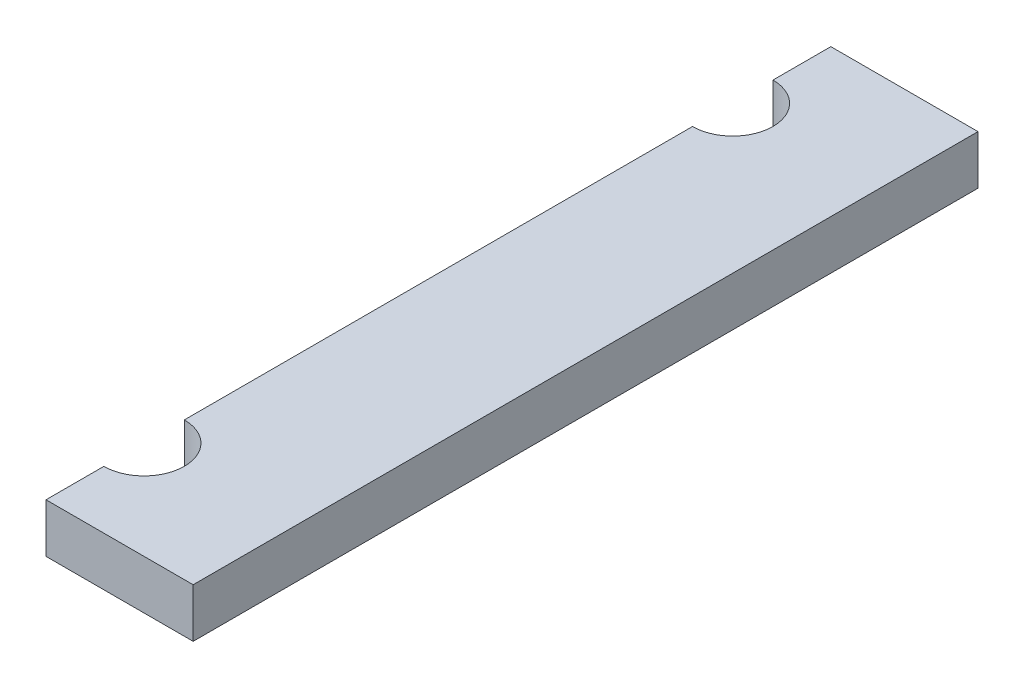
ISO-10303-21;
HEADER;
FILE_DESCRIPTION(('STEP AP214'),'2;1');
FILE_NAME('part.step','',(''),(''),'','','');
FILE_SCHEMA(('AUTOMOTIVE_DESIGN { 1 0 10303 214 1 1 1 1 }'));
ENDSEC;
DATA;
#1=APPLICATION_CONTEXT('core data for automotive mechanical design processes');
#2=APPLICATION_PROTOCOL_DEFINITION('international standard','automotive_design',2000,#1);
#3=PRODUCT_CONTEXT('',#1,'mechanical');
#4=PRODUCT('Part','Part','',(#3));
#5=PRODUCT_RELATED_PRODUCT_CATEGORY('part','',(#4));
#6=PRODUCT_DEFINITION_FORMATION('','',#4);
#7=PRODUCT_DEFINITION_CONTEXT('part definition',#1,'design');
#8=PRODUCT_DEFINITION('design','',#6,#7);
#9=PRODUCT_DEFINITION_SHAPE('','',#8);
#10=(LENGTH_UNIT() NAMED_UNIT(*) SI_UNIT(.MILLI.,.METRE.));
#11=(NAMED_UNIT(*) PLANE_ANGLE_UNIT() SI_UNIT($,.RADIAN.));
#12=(NAMED_UNIT(*) SI_UNIT($,.STERADIAN.) SOLID_ANGLE_UNIT());
#13=UNCERTAINTY_MEASURE_WITH_UNIT(LENGTH_MEASURE(1.E-05),#10,'distance_accuracy_value','');
#14=(GEOMETRIC_REPRESENTATION_CONTEXT(3) GLOBAL_UNCERTAINTY_ASSIGNED_CONTEXT((#13)) GLOBAL_UNIT_ASSIGNED_CONTEXT((#10,
#11,#12)) REPRESENTATION_CONTEXT('',''));
#15=CARTESIAN_POINT('',(0.,0.,0.));
#16=DIRECTION('',(0.,0.,1.));
#17=DIRECTION('',(1.,0.,0.));
#18=AXIS2_PLACEMENT_3D('',#15,#16,#17);
#19=CARTESIAN_POINT('',(15.,5.,0.));
#20=DIRECTION('',(-1.,0.,0.));
#21=DIRECTION('',(0.,0.,1.));
#22=AXIS2_PLACEMENT_3D('',#19,#20,#21);
#23=PLANE('',#22);
#24=DIRECTION('',(0.,0.,-1.));
#25=VECTOR('',#24,1.);
#26=CARTESIAN_POINT('',(15.,0.,0.));
#27=LINE('',#26,#25);
#28=CARTESIAN_POINT('',(15.,0.,0.));
#29=VERTEX_POINT('',#28);
#30=CARTESIAN_POINT('',(15.,0.,-80.));
#31=VERTEX_POINT('',#30);
#32=EDGE_CURVE('E197',#29,#31,#27,.T.);
#33=ORIENTED_EDGE('',*,*,#32,.T.);
#34=DIRECTION('',(0.,-1.,0.));
#35=VECTOR('',#34,1.);
#36=CARTESIAN_POINT('',(15.,5.,-80.));
#37=LINE('',#36,#35);
#38=CARTESIAN_POINT('',(15.,5.,-80.));
#39=VERTEX_POINT('',#38);
#40=EDGE_CURVE('E11',#39,#31,#37,.T.);
#41=ORIENTED_EDGE('',*,*,#40,.F.);
#42=DIRECTION('',(0.,0.,-1.));
#43=VECTOR('',#42,1.);
#44=CARTESIAN_POINT('',(15.,5.,0.));
#45=LINE('',#44,#43);
#46=CARTESIAN_POINT('',(15.,5.,0.));
#47=VERTEX_POINT('',#46);
#48=EDGE_CURVE('E100',#47,#39,#45,.T.);
#49=ORIENTED_EDGE('',*,*,#48,.F.);
#50=DIRECTION('',(0.,-1.,0.));
#51=VECTOR('',#50,1.);
#52=CARTESIAN_POINT('',(15.,5.,0.));
#53=LINE('',#52,#51);
#54=EDGE_CURVE('E142',#47,#29,#53,.T.);
#55=ORIENTED_EDGE('',*,*,#54,.T.);
#56=EDGE_LOOP('',(#33,#41,#49,#55));
#57=FACE_BOUND('',#56,.T.);
#58=ADVANCED_FACE('F47',(#57),#23,.F.);
#59=CARTESIAN_POINT('',(0.,5.,-80.));
#60=DIRECTION('',(0.,0.,-1.));
#61=DIRECTION('',(-1.,0.,0.));
#62=AXIS2_PLACEMENT_3D('',#59,#60,#61);
#63=PLANE('',#62);
#64=DIRECTION('',(1.,0.,0.));
#65=VECTOR('',#64,1.);
#66=CARTESIAN_POINT('',(0.,0.,-80.));
#67=LINE('',#66,#65);
#68=CARTESIAN_POINT('',(0.,0.,-80.));
#69=VERTEX_POINT('',#68);
#70=EDGE_CURVE('E191',#69,#31,#67,.T.);
#71=ORIENTED_EDGE('',*,*,#70,.F.);
#72=DIRECTION('',(0.,-1.,0.));
#73=VECTOR('',#72,1.);
#74=CARTESIAN_POINT('',(0.,5.,-80.));
#75=LINE('',#74,#73);
#76=CARTESIAN_POINT('',(0.,5.,-80.));
#77=VERTEX_POINT('',#76);
#78=EDGE_CURVE('E56',#77,#69,#75,.T.);
#79=ORIENTED_EDGE('',*,*,#78,.F.);
#80=DIRECTION('',(1.,0.,0.));
#81=VECTOR('',#80,1.);
#82=CARTESIAN_POINT('',(0.,5.,-80.));
#83=LINE('',#82,#81);
#84=EDGE_CURVE('E154',#77,#39,#83,.T.);
#85=ORIENTED_EDGE('',*,*,#84,.T.);
#86=ORIENTED_EDGE('',*,*,#40,.T.);
#87=EDGE_LOOP('',(#71,#79,#85,#86));
#88=FACE_BOUND('',#87,.T.);
#89=ADVANCED_FACE('F192',(#88),#63,.T.);
#90=CARTESIAN_POINT('',(0.,5.,0.));
#91=DIRECTION('',(-1.,0.,0.));
#92=DIRECTION('',(0.,0.,1.));
#93=AXIS2_PLACEMENT_3D('',#90,#91,#92);
#94=PLANE('',#93);
#95=DIRECTION('',(0.,0.,-1.));
#96=VECTOR('',#95,1.);
#97=CARTESIAN_POINT('',(0.,0.,0.));
#98=LINE('',#97,#96);
#99=CARTESIAN_POINT('',(0.,0.,-74.1));
#100=VERTEX_POINT('',#99);
#101=EDGE_CURVE('E186',#100,#69,#98,.T.);
#102=ORIENTED_EDGE('',*,*,#101,.F.);
#103=DIRECTION('',(0.,-1.,0.));
#104=VECTOR('',#103,1.);
#105=CARTESIAN_POINT('',(0.,5.,-74.1));
#106=LINE('',#105,#104);
#107=CARTESIAN_POINT('',(0.,5.,-74.1));
#108=VERTEX_POINT('',#107);
#109=EDGE_CURVE('E178',#108,#100,#106,.T.);
#110=ORIENTED_EDGE('',*,*,#109,.F.);
#111=DIRECTION('',(0.,0.,-1.));
#112=VECTOR('',#111,1.);
#113=CARTESIAN_POINT('',(0.,5.,0.));
#114=LINE('',#113,#112);
#115=EDGE_CURVE('E150',#108,#77,#114,.T.);
#116=ORIENTED_EDGE('',*,*,#115,.T.);
#117=ORIENTED_EDGE('',*,*,#78,.T.);
#118=EDGE_LOOP('',(#102,#110,#116,#117));
#119=FACE_BOUND('',#118,.T.);
#120=ADVANCED_FACE('F184',(#119),#94,.T.);
#121=CARTESIAN_POINT('',(0.,5.,-70.));
#122=DIRECTION('',(0.,-1.,0.));
#123=DIRECTION('',(0.,0.,-1.));
#124=AXIS2_PLACEMENT_3D('',#121,#122,#123);
#125=CYLINDRICAL_SURFACE('',#124,4.1);
#126=CARTESIAN_POINT('',(0.,0.,-70.));
#127=DIRECTION('',(0.,1.,0.));
#128=DIRECTION('',(0.,0.,1.));
#129=AXIS2_PLACEMENT_3D('',#126,#127,#128);
#130=CIRCLE('',#129,4.1);
#131=CARTESIAN_POINT('',(0.,0.,-65.9));
#132=VERTEX_POINT('',#131);
#133=EDGE_CURVE('E202',#132,#100,#130,.T.);
#134=ORIENTED_EDGE('',*,*,#133,.F.);
#135=DIRECTION('',(0.,-1.,0.));
#136=VECTOR('',#135,1.);
#137=CARTESIAN_POINT('',(0.,5.,-65.9));
#138=LINE('',#137,#136);
#139=CARTESIAN_POINT('',(0.,5.,-65.9));
#140=VERTEX_POINT('',#139);
#141=EDGE_CURVE('E175',#140,#132,#138,.T.);
#142=ORIENTED_EDGE('',*,*,#141,.F.);
#143=CARTESIAN_POINT('',(0.,5.,-70.));
#144=DIRECTION('',(0.,1.,0.));
#145=DIRECTION('',(0.,0.,1.));
#146=AXIS2_PLACEMENT_3D('',#143,#144,#145);
#147=CIRCLE('',#146,4.1);
#148=EDGE_CURVE('E146',#140,#108,#147,.T.);
#149=ORIENTED_EDGE('',*,*,#148,.T.);
#150=ORIENTED_EDGE('',*,*,#109,.T.);
#151=EDGE_LOOP('',(#134,#142,#149,#150));
#152=FACE_BOUND('',#151,.T.);
#153=ADVANCED_FACE('F212',(#152),#125,.F.);
#154=CARTESIAN_POINT('',(0.,5.,0.));
#155=DIRECTION('',(-1.,0.,0.));
#156=DIRECTION('',(0.,0.,1.));
#157=AXIS2_PLACEMENT_3D('',#154,#155,#156);
#158=PLANE('',#157);
#159=DIRECTION('',(0.,0.,-1.));
#160=VECTOR('',#159,1.);
#161=CARTESIAN_POINT('',(0.,0.,0.));
#162=LINE('',#161,#160);
#163=CARTESIAN_POINT('',(0.,0.,-14.1));
#164=VERTEX_POINT('',#163);
#165=EDGE_CURVE('E166',#164,#132,#162,.T.);
#166=ORIENTED_EDGE('',*,*,#165,.F.);
#167=DIRECTION('',(0.,-1.,0.));
#168=VECTOR('',#167,1.);
#169=CARTESIAN_POINT('',(0.,5.,-14.1));
#170=LINE('',#169,#168);
#171=CARTESIAN_POINT('',(0.,5.,-14.1));
#172=VERTEX_POINT('',#171);
#173=EDGE_CURVE('E136',#172,#164,#170,.T.);
#174=ORIENTED_EDGE('',*,*,#173,.F.);
#175=DIRECTION('',(0.,0.,-1.));
#176=VECTOR('',#175,1.);
#177=CARTESIAN_POINT('',(0.,5.,0.));
#178=LINE('',#177,#176);
#179=EDGE_CURVE('E123',#172,#140,#178,.T.);
#180=ORIENTED_EDGE('',*,*,#179,.T.);
#181=ORIENTED_EDGE('',*,*,#141,.T.);
#182=EDGE_LOOP('',(#166,#174,#180,#181));
#183=FACE_BOUND('',#182,.T.);
#184=ADVANCED_FACE('F211',(#183),#158,.T.);
#185=CARTESIAN_POINT('',(0.,5.,-9.99999999999999));
#186=DIRECTION('',(0.,-1.,0.));
#187=DIRECTION('',(0.,0.,-1.));
#188=AXIS2_PLACEMENT_3D('',#185,#186,#187);
#189=CYLINDRICAL_SURFACE('',#188,4.1);
#190=CARTESIAN_POINT('',(0.,0.,-9.99999999999999));
#191=DIRECTION('',(0.,1.,0.));
#192=DIRECTION('',(0.,0.,1.));
#193=AXIS2_PLACEMENT_3D('',#190,#191,#192);
#194=CIRCLE('',#193,4.1);
#195=CARTESIAN_POINT('',(0.,0.,-5.9));
#196=VERTEX_POINT('',#195);
#197=EDGE_CURVE('E131',#164,#196,#194,.F.);
#198=ORIENTED_EDGE('',*,*,#197,.T.);
#199=DIRECTION('',(0.,-1.,0.));
#200=VECTOR('',#199,1.);
#201=CARTESIAN_POINT('',(0.,5.,-5.9));
#202=LINE('',#201,#200);
#203=CARTESIAN_POINT('',(0.,5.,-5.9));
#204=VERTEX_POINT('',#203);
#205=EDGE_CURVE('E128',#204,#196,#202,.T.);
#206=ORIENTED_EDGE('',*,*,#205,.F.);
#207=CARTESIAN_POINT('',(0.,5.,-9.99999999999999));
#208=DIRECTION('',(0.,1.,0.));
#209=DIRECTION('',(0.,0.,1.));
#210=AXIS2_PLACEMENT_3D('',#207,#208,#209);
#211=CIRCLE('',#210,4.1);
#212=EDGE_CURVE('E116',#172,#204,#211,.F.);
#213=ORIENTED_EDGE('',*,*,#212,.F.);
#214=ORIENTED_EDGE('',*,*,#173,.T.);
#215=EDGE_LOOP('',(#198,#206,#213,#214));
#216=FACE_BOUND('',#215,.T.);
#217=ADVANCED_FACE('F129',(#216),#189,.F.);
#218=CARTESIAN_POINT('',(0.,0.,0.));
#219=VERTEX_POINT('',#218);
#220=EDGE_CURVE('E162',#219,#196,#162,.T.);
#221=ORIENTED_EDGE('',*,*,#220,.F.);
#222=DIRECTION('',(0.,-1.,0.));
#223=VECTOR('',#222,1.);
#224=CARTESIAN_POINT('',(0.,5.,0.));
#225=LINE('',#224,#223);
#226=CARTESIAN_POINT('',(0.,5.,0.));
#227=VERTEX_POINT('',#226);
#228=EDGE_CURVE('E91',#227,#219,#225,.T.);
#229=ORIENTED_EDGE('',*,*,#228,.F.);
#230=EDGE_CURVE('E120',#227,#204,#178,.T.);
#231=ORIENTED_EDGE('',*,*,#230,.T.);
#232=ORIENTED_EDGE('',*,*,#205,.T.);
#233=EDGE_LOOP('',(#221,#229,#231,#232));
#234=FACE_BOUND('',#233,.T.);
#235=ADVANCED_FACE('F138',(#234),#158,.T.);
#236=CARTESIAN_POINT('',(0.,5.,0.));
#237=DIRECTION('',(0.,0.,-1.));
#238=DIRECTION('',(-1.,0.,0.));
#239=AXIS2_PLACEMENT_3D('',#236,#237,#238);
#240=PLANE('',#239);
#241=DIRECTION('',(1.,0.,0.));
#242=VECTOR('',#241,1.);
#243=CARTESIAN_POINT('',(0.,0.,0.));
#244=LINE('',#243,#242);
#245=EDGE_CURVE('E94',#219,#29,#244,.T.);
#246=ORIENTED_EDGE('',*,*,#245,.T.);
#247=ORIENTED_EDGE('',*,*,#54,.F.);
#248=DIRECTION('',(1.,0.,0.));
#249=VECTOR('',#248,1.);
#250=CARTESIAN_POINT('',(0.,5.,0.));
#251=LINE('',#250,#249);
#252=EDGE_CURVE('E64',#227,#47,#251,.T.);
#253=ORIENTED_EDGE('',*,*,#252,.F.);
#254=ORIENTED_EDGE('',*,*,#228,.T.);
#255=EDGE_LOOP('',(#246,#247,#253,#254));
#256=FACE_BOUND('',#255,.T.);
#257=ADVANCED_FACE('F228',(#256),#240,.F.);
#258=CARTESIAN_POINT('',(0.,5.,0.));
#259=DIRECTION('',(0.,1.,0.));
#260=DIRECTION('',(0.,0.,1.));
#261=AXIS2_PLACEMENT_3D('',#258,#259,#260);
#262=PLANE('',#261);
#263=ORIENTED_EDGE('',*,*,#48,.T.);
#264=ORIENTED_EDGE('',*,*,#84,.F.);
#265=ORIENTED_EDGE('',*,*,#115,.F.);
#266=ORIENTED_EDGE('',*,*,#148,.F.);
#267=ORIENTED_EDGE('',*,*,#179,.F.);
#268=ORIENTED_EDGE('',*,*,#212,.T.);
#269=ORIENTED_EDGE('',*,*,#230,.F.);
#270=ORIENTED_EDGE('',*,*,#252,.T.);
#271=EDGE_LOOP('',(#263,#264,#265,#266,#267,#268,#269,#270));
#272=FACE_BOUND('',#271,.T.);
#273=ADVANCED_FACE('F118',(#272),#262,.T.);
#274=CARTESIAN_POINT('',(0.,0.,0.));
#275=DIRECTION('',(0.,1.,0.));
#276=DIRECTION('',(0.,0.,1.));
#277=AXIS2_PLACEMENT_3D('',#274,#275,#276);
#278=PLANE('',#277);
#279=ORIENTED_EDGE('',*,*,#32,.F.);
#280=ORIENTED_EDGE('',*,*,#245,.F.);
#281=ORIENTED_EDGE('',*,*,#220,.T.);
#282=ORIENTED_EDGE('',*,*,#197,.F.);
#283=ORIENTED_EDGE('',*,*,#165,.T.);
#284=ORIENTED_EDGE('',*,*,#133,.T.);
#285=ORIENTED_EDGE('',*,*,#101,.T.);
#286=ORIENTED_EDGE('',*,*,#70,.T.);
#287=EDGE_LOOP('',(#279,#280,#281,#282,#283,#284,#285,#286));
#288=FACE_BOUND('',#287,.T.);
#289=ADVANCED_FACE('F199',(#288),#278,.F.);
#290=CLOSED_SHELL('',(#58,#89,#120,#153,#184,#217,#235,#257,#273,#289));
#291=MANIFOLD_SOLID_BREP('B2',#290);
#292=ADVANCED_BREP_SHAPE_REPRESENTATION('',(#18,#291),#14);
#293=SHAPE_DEFINITION_REPRESENTATION(#9,#292);
ENDSEC;
END-ISO-10303-21;
